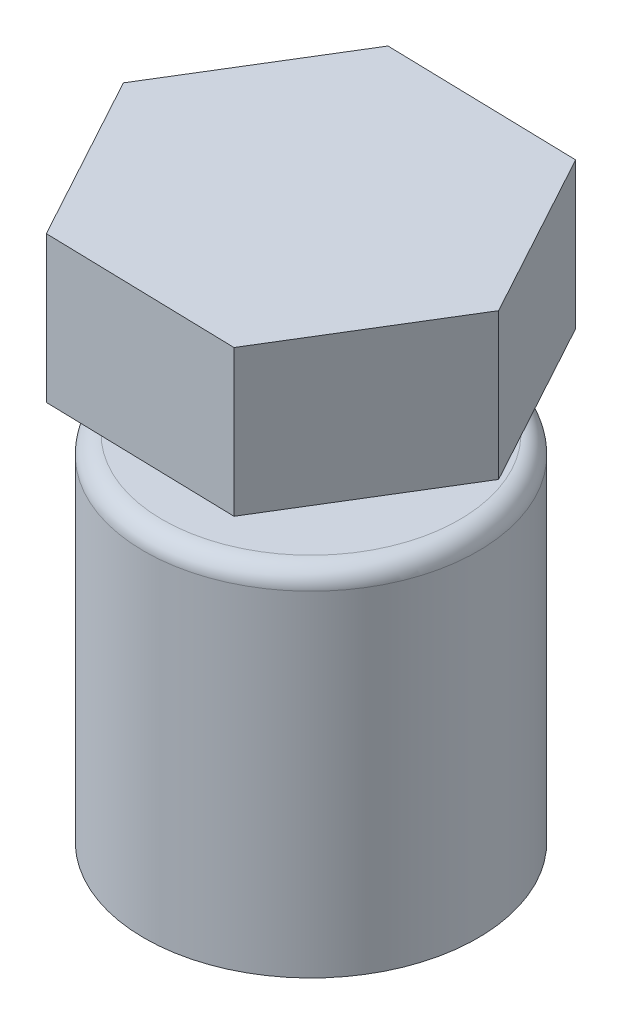
ISO-10303-21;
HEADER;
FILE_DESCRIPTION(('STEP AP214'),'2;1');
FILE_NAME('part.step','',(''),(''),'','','');
FILE_SCHEMA(('AUTOMOTIVE_DESIGN { 1 0 10303 214 1 1 1 1 }'));
ENDSEC;
DATA;
#1=APPLICATION_CONTEXT('core data for automotive mechanical design processes');
#2=APPLICATION_PROTOCOL_DEFINITION('international standard','automotive_design',2000,#1);
#3=PRODUCT_CONTEXT('',#1,'mechanical');
#4=PRODUCT('Part','Part','',(#3));
#5=PRODUCT_RELATED_PRODUCT_CATEGORY('part','',(#4));
#6=PRODUCT_DEFINITION_FORMATION('','',#4);
#7=PRODUCT_DEFINITION_CONTEXT('part definition',#1,'design');
#8=PRODUCT_DEFINITION('design','',#6,#7);
#9=PRODUCT_DEFINITION_SHAPE('','',#8);
#10=(LENGTH_UNIT() NAMED_UNIT(*) SI_UNIT(.MILLI.,.METRE.));
#11=(NAMED_UNIT(*) PLANE_ANGLE_UNIT() SI_UNIT($,.RADIAN.));
#12=(NAMED_UNIT(*) SI_UNIT($,.STERADIAN.) SOLID_ANGLE_UNIT());
#13=UNCERTAINTY_MEASURE_WITH_UNIT(LENGTH_MEASURE(1.E-05),#10,'distance_accuracy_value','');
#14=(GEOMETRIC_REPRESENTATION_CONTEXT(3) GLOBAL_UNCERTAINTY_ASSIGNED_CONTEXT((#13)) GLOBAL_UNIT_ASSIGNED_CONTEXT((#10,
#11,#12)) REPRESENTATION_CONTEXT('',''));
#15=CARTESIAN_POINT('',(0.,0.,0.));
#16=DIRECTION('',(0.,0.,1.));
#17=DIRECTION('',(1.,0.,0.));
#18=AXIS2_PLACEMENT_3D('',#15,#16,#17);
#19=CARTESIAN_POINT('',(25.1890899135529,67.5796969338963,46.2679708336783));
#20=DIRECTION('',(-0.853229121791607,0.,-0.521536255428827));
#21=DIRECTION('',(-0.521536255428827,0.,0.853229121791607));
#22=AXIS2_PLACEMENT_3D('',#19,#20,#21);
#23=PLANE('',#22);
#24=DIRECTION('',(0.521536255428827,0.,-0.853229121791607));
#25=VECTOR('',#24,1.);
#26=CARTESIAN_POINT('',(25.1890899135529,27.5796969338963,46.2679708336783));
#27=LINE('',#26,#25);
#28=CARTESIAN_POINT('',(25.1890899135529,27.5796969338963,46.2679708336783));
#29=VERTEX_POINT('',#28);
#30=CARTESIAN_POINT('',(52.6637830802993,27.5796969338963,1.31959365349194));
#31=VERTEX_POINT('',#30);
#32=EDGE_CURVE('E135',#29,#31,#27,.T.);
#33=ORIENTED_EDGE('',*,*,#32,.T.);
#34=DIRECTION('',(0.,-1.,0.));
#35=VECTOR('',#34,1.);
#36=CARTESIAN_POINT('',(52.6637830802993,67.5796969338963,1.31959365349194));
#37=LINE('',#36,#35);
#38=CARTESIAN_POINT('',(52.6637830802993,67.5796969338963,1.31959365349194));
#39=VERTEX_POINT('',#38);
#40=EDGE_CURVE('E12',#39,#31,#37,.T.);
#41=ORIENTED_EDGE('',*,*,#40,.F.);
#42=DIRECTION('',(0.521536255428827,0.,-0.853229121791607));
#43=VECTOR('',#42,1.);
#44=CARTESIAN_POINT('',(25.1890899135529,67.5796969338963,46.2679708336783));
#45=LINE('',#44,#43);
#46=CARTESIAN_POINT('',(25.1890899135529,67.5796969338963,46.2679708336783));
#47=VERTEX_POINT('',#46);
#48=EDGE_CURVE('E146',#47,#39,#45,.T.);
#49=ORIENTED_EDGE('',*,*,#48,.F.);
#50=DIRECTION('',(0.,-1.,0.));
#51=VECTOR('',#50,1.);
#52=CARTESIAN_POINT('',(25.1890899135529,67.5796969338963,46.2679708336783));
#53=LINE('',#52,#51);
#54=EDGE_CURVE('E131',#47,#29,#53,.T.);
#55=ORIENTED_EDGE('',*,*,#54,.T.);
#56=EDGE_LOOP('',(#33,#41,#49,#55));
#57=FACE_BOUND('',#56,.T.);
#58=ADVANCED_FACE('F51',(#57),#23,.F.);
#59=CARTESIAN_POINT('',(52.6637830802993,67.5796969338963,1.31959365349194));
#60=DIRECTION('',(-0.878278207091778,0.,0.478149967005805));
#61=DIRECTION('',(0.478149967005805,0.,0.878278207091778));
#62=AXIS2_PLACEMENT_3D('',#59,#60,#61);
#63=PLANE('',#62);
#64=DIRECTION('',(-0.478149967005805,0.,-0.878278207091778));
#65=VECTOR('',#64,1.);
#66=CARTESIAN_POINT('',(52.6637830802993,27.5796969338963,1.31959365349194));
#67=LINE('',#66,#65);
#68=CARTESIAN_POINT('',(27.4746931667464,27.5796969338963,-44.9483771801863));
#69=VERTEX_POINT('',#68);
#70=EDGE_CURVE('E138',#31,#69,#67,.T.);
#71=ORIENTED_EDGE('',*,*,#70,.T.);
#72=DIRECTION('',(0.,-1.,0.));
#73=VECTOR('',#72,1.);
#74=CARTESIAN_POINT('',(27.4746931667464,67.5796969338963,-44.9483771801863));
#75=LINE('',#74,#73);
#76=CARTESIAN_POINT('',(27.4746931667464,67.5796969338963,-44.9483771801863));
#77=VERTEX_POINT('',#76);
#78=EDGE_CURVE('E59',#77,#69,#75,.T.);
#79=ORIENTED_EDGE('',*,*,#78,.F.);
#80=DIRECTION('',(-0.478149967005805,0.,-0.878278207091778));
#81=VECTOR('',#80,1.);
#82=CARTESIAN_POINT('',(52.6637830802993,67.5796969338963,1.31959365349194));
#83=LINE('',#82,#81);
#84=EDGE_CURVE('E104',#39,#77,#83,.T.);
#85=ORIENTED_EDGE('',*,*,#84,.F.);
#86=ORIENTED_EDGE('',*,*,#40,.T.);
#87=EDGE_LOOP('',(#71,#79,#85,#86));
#88=FACE_BOUND('',#87,.T.);
#89=ADVANCED_FACE('F171',(#88),#63,.F.);
#90=CARTESIAN_POINT('',(27.4746931667464,67.5796969338963,-44.9483771801863));
#91=DIRECTION('',(-0.0250490853001705,0.,0.999686222434632));
#92=DIRECTION('',(0.999686222434632,0.,0.0250490853001705));
#93=AXIS2_PLACEMENT_3D('',#90,#91,#92);
#94=PLANE('',#93);
#95=DIRECTION('',(-0.999686222434632,0.,-0.0250490853001705));
#96=VECTOR('',#95,1.);
#97=CARTESIAN_POINT('',(27.4746931667464,27.5796969338963,-44.9483771801863));
#98=LINE('',#97,#96);
#99=CARTESIAN_POINT('',(-25.1890899135529,27.5796969338963,-46.2679708336783));
#100=VERTEX_POINT('',#99);
#101=EDGE_CURVE('E141',#69,#100,#98,.T.);
#102=ORIENTED_EDGE('',*,*,#101,.T.);
#103=DIRECTION('',(0.,-1.,0.));
#104=VECTOR('',#103,1.);
#105=CARTESIAN_POINT('',(-25.1890899135529,67.5796969338963,-46.2679708336783));
#106=LINE('',#105,#104);
#107=CARTESIAN_POINT('',(-25.1890899135529,67.5796969338963,-46.2679708336783));
#108=VERTEX_POINT('',#107);
#109=EDGE_CURVE('E126',#108,#100,#106,.T.);
#110=ORIENTED_EDGE('',*,*,#109,.F.);
#111=DIRECTION('',(-0.999686222434632,0.,-0.0250490853001705));
#112=VECTOR('',#111,1.);
#113=CARTESIAN_POINT('',(27.4746931667464,67.5796969338963,-44.9483771801863));
#114=LINE('',#113,#112);
#115=EDGE_CURVE('E117',#77,#108,#114,.T.);
#116=ORIENTED_EDGE('',*,*,#115,.F.);
#117=ORIENTED_EDGE('',*,*,#78,.T.);
#118=EDGE_LOOP('',(#102,#110,#116,#117));
#119=FACE_BOUND('',#118,.T.);
#120=ADVANCED_FACE('F152',(#119),#94,.F.);
#121=CARTESIAN_POINT('',(-25.1890899135529,67.5796969338963,-46.2679708336783));
#122=DIRECTION('',(0.853229121791607,0.,0.521536255428827));
#123=DIRECTION('',(0.521536255428827,0.,-0.853229121791607));
#124=AXIS2_PLACEMENT_3D('',#121,#122,#123);
#125=PLANE('',#124);
#126=DIRECTION('',(-0.521536255428827,0.,0.853229121791607));
#127=VECTOR('',#126,1.);
#128=CARTESIAN_POINT('',(-25.1890899135529,27.5796969338963,-46.2679708336783));
#129=LINE('',#128,#127);
#130=CARTESIAN_POINT('',(-52.6637830802993,27.5796969338963,-1.31959365349196));
#131=VERTEX_POINT('',#130);
#132=EDGE_CURVE('E125',#100,#131,#129,.T.);
#133=ORIENTED_EDGE('',*,*,#132,.T.);
#134=DIRECTION('',(0.,-1.,0.));
#135=VECTOR('',#134,1.);
#136=CARTESIAN_POINT('',(-52.6637830802993,67.5796969338963,-1.31959365349196));
#137=LINE('',#136,#135);
#138=CARTESIAN_POINT('',(-52.6637830802993,67.5796969338963,-1.31959365349196));
#139=VERTEX_POINT('',#138);
#140=EDGE_CURVE('E122',#139,#131,#137,.T.);
#141=ORIENTED_EDGE('',*,*,#140,.F.);
#142=DIRECTION('',(-0.521536255428827,0.,0.853229121791607));
#143=VECTOR('',#142,1.);
#144=CARTESIAN_POINT('',(-25.1890899135529,67.5796969338963,-46.2679708336783));
#145=LINE('',#144,#143);
#146=EDGE_CURVE('E111',#108,#139,#145,.T.);
#147=ORIENTED_EDGE('',*,*,#146,.F.);
#148=ORIENTED_EDGE('',*,*,#109,.T.);
#149=EDGE_LOOP('',(#133,#141,#147,#148));
#150=FACE_BOUND('',#149,.T.);
#151=ADVANCED_FACE('F123',(#150),#125,.F.);
#152=CARTESIAN_POINT('',(-52.6637830802993,67.5796969338963,-1.31959365349196));
#153=DIRECTION('',(0.878278207091778,0.,-0.478149967005805));
#154=DIRECTION('',(-0.478149967005805,0.,-0.878278207091778));
#155=AXIS2_PLACEMENT_3D('',#152,#153,#154);
#156=PLANE('',#155);
#157=DIRECTION('',(0.478149967005805,0.,0.878278207091778));
#158=VECTOR('',#157,1.);
#159=CARTESIAN_POINT('',(-52.6637830802993,27.5796969338963,-1.31959365349196));
#160=LINE('',#159,#158);
#161=CARTESIAN_POINT('',(-27.4746931667464,27.5796969338963,44.9483771801863));
#162=VERTEX_POINT('',#161);
#163=EDGE_CURVE('E90',#131,#162,#160,.T.);
#164=ORIENTED_EDGE('',*,*,#163,.T.);
#165=DIRECTION('',(0.,-1.,0.));
#166=VECTOR('',#165,1.);
#167=CARTESIAN_POINT('',(-27.4746931667464,67.5796969338963,44.9483771801863));
#168=LINE('',#167,#166);
#169=CARTESIAN_POINT('',(-27.4746931667464,67.5796969338963,44.9483771801863));
#170=VERTEX_POINT('',#169);
#171=EDGE_CURVE('E127',#170,#162,#168,.T.);
#172=ORIENTED_EDGE('',*,*,#171,.F.);
#173=DIRECTION('',(0.478149967005805,0.,0.878278207091778));
#174=VECTOR('',#173,1.);
#175=CARTESIAN_POINT('',(-52.6637830802993,67.5796969338963,-1.31959365349196));
#176=LINE('',#175,#174);
#177=EDGE_CURVE('E115',#139,#170,#176,.T.);
#178=ORIENTED_EDGE('',*,*,#177,.F.);
#179=ORIENTED_EDGE('',*,*,#140,.T.);
#180=EDGE_LOOP('',(#164,#172,#178,#179));
#181=FACE_BOUND('',#180,.T.);
#182=ADVANCED_FACE('F129',(#181),#156,.F.);
#183=CARTESIAN_POINT('',(-27.4746931667464,67.5796969338963,44.9483771801863));
#184=DIRECTION('',(0.0250490853001707,0.,-0.999686222434632));
#185=DIRECTION('',(-0.999686222434632,0.,-0.0250490853001707));
#186=AXIS2_PLACEMENT_3D('',#183,#184,#185);
#187=PLANE('',#186);
#188=DIRECTION('',(0.999686222434632,0.,0.0250490853001707));
#189=VECTOR('',#188,1.);
#190=CARTESIAN_POINT('',(-27.4746931667464,27.5796969338963,44.9483771801863));
#191=LINE('',#190,#189);
#192=EDGE_CURVE('E96',#162,#29,#191,.T.);
#193=ORIENTED_EDGE('',*,*,#192,.T.);
#194=ORIENTED_EDGE('',*,*,#54,.F.);
#195=DIRECTION('',(0.999686222434632,0.,0.0250490853001707));
#196=VECTOR('',#195,1.);
#197=CARTESIAN_POINT('',(-27.4746931667464,67.5796969338963,44.9483771801863));
#198=LINE('',#197,#196);
#199=EDGE_CURVE('E67',#170,#47,#198,.T.);
#200=ORIENTED_EDGE('',*,*,#199,.F.);
#201=ORIENTED_EDGE('',*,*,#171,.T.);
#202=EDGE_LOOP('',(#193,#194,#200,#201));
#203=FACE_BOUND('',#202,.T.);
#204=ADVANCED_FACE('F160',(#203),#187,.F.);
#205=CARTESIAN_POINT('',(0.,67.5796969338963,0.));
#206=DIRECTION('',(0.,1.,0.));
#207=DIRECTION('',(0.,0.,1.));
#208=AXIS2_PLACEMENT_3D('',#205,#206,#207);
#209=PLANE('',#208);
#210=ORIENTED_EDGE('',*,*,#48,.T.);
#211=ORIENTED_EDGE('',*,*,#84,.T.);
#212=ORIENTED_EDGE('',*,*,#115,.T.);
#213=ORIENTED_EDGE('',*,*,#146,.T.);
#214=ORIENTED_EDGE('',*,*,#177,.T.);
#215=ORIENTED_EDGE('',*,*,#199,.T.);
#216=EDGE_LOOP('',(#210,#211,#212,#213,#214,#215));
#217=FACE_BOUND('',#216,.T.);
#218=ADVANCED_FACE('F113',(#217),#209,.T.);
#219=CARTESIAN_POINT('',(0.,27.5796969338963,0.));
#220=DIRECTION('',(0.,1.,0.));
#221=DIRECTION('',(0.,0.,1.));
#222=AXIS2_PLACEMENT_3D('',#219,#220,#221);
#223=PLANE('',#222);
#224=ORIENTED_EDGE('',*,*,#32,.F.);
#225=ORIENTED_EDGE('',*,*,#192,.F.);
#226=ORIENTED_EDGE('',*,*,#163,.F.);
#227=ORIENTED_EDGE('',*,*,#132,.F.);
#228=ORIENTED_EDGE('',*,*,#101,.F.);
#229=ORIENTED_EDGE('',*,*,#70,.F.);
#230=EDGE_LOOP('',(#224,#225,#226,#227,#228,#229));
#231=FACE_BOUND('',#230,.T.);
#232=CARTESIAN_POINT('',(0.,27.5796969338963,0.));
#233=DIRECTION('',(0.,-1.,0.));
#234=DIRECTION('',(0.,0.,-1.));
#235=AXIS2_PLACEMENT_3D('',#232,#233,#234);
#236=CIRCLE('',#235,13.6609713784719);
#237=CARTESIAN_POINT('',(0.,27.5796969338963,-13.6609713784719));
#238=VERTEX_POINT('',#237);
#239=EDGE_CURVE('E294',#238,#238,#236,.T.);
#240=ORIENTED_EDGE('',*,*,#239,.F.);
#241=EDGE_LOOP('',(#240));
#242=FACE_BOUND('',#241,.T.);
#243=ADVANCED_FACE('F155',(#231,#242),#223,.F.);
#244=CARTESIAN_POINT('',(0.,53.6443526419248,0.));
#245=DIRECTION('',(0.,1.,0.));
#246=DIRECTION('',(0.,0.,1.));
#247=AXIS2_PLACEMENT_3D('',#244,#245,#246);
#248=PLANE('',#247);
#249=CARTESIAN_POINT('',(0.,53.6443526419248,0.));
#250=DIRECTION('',(0.,-1.,0.));
#251=DIRECTION('',(0.,0.,-1.));
#252=AXIS2_PLACEMENT_3D('',#249,#250,#251);
#253=CIRCLE('',#252,9.53690454723516);
#254=CARTESIAN_POINT('',(0.,53.6443526419248,-9.53690454723516));
#255=VERTEX_POINT('',#254);
#256=EDGE_CURVE('E139',#255,#255,#253,.T.);
#257=ORIENTED_EDGE('',*,*,#256,.T.);
#258=EDGE_LOOP('',(#257));
#259=FACE_BOUND('',#258,.T.);
#260=ADVANCED_FACE('F211',(#259),#248,.F.);
#261=CARTESIAN_POINT('',(0.,5.92834606990293,0.));
#262=DIRECTION('',(0.,-1.,0.));
#263=DIRECTION('',(0.,0.,-1.));
#264=AXIS2_PLACEMENT_3D('',#261,#262,#263);
#265=CYLINDRICAL_SURFACE('',#264,9.53690454723516);
#266=ORIENTED_EDGE('',*,*,#256,.F.);
#267=EDGE_LOOP('',(#266));
#268=FACE_BOUND('',#267,.T.);
#269=CARTESIAN_POINT('',(0.,41.4860456563702,0.));
#270=DIRECTION('',(0.,-1.,0.));
#271=DIRECTION('',(0.,0.,-1.));
#272=AXIS2_PLACEMENT_3D('',#269,#270,#271);
#273=CIRCLE('',#272,9.53690454723516);
#274=CARTESIAN_POINT('',(0.,41.4860456563702,-9.53690454723516));
#275=VERTEX_POINT('',#274);
#276=EDGE_CURVE('E296',#275,#275,#273,.T.);
#277=ORIENTED_EDGE('',*,*,#276,.T.);
#278=EDGE_LOOP('',(#277));
#279=FACE_BOUND('',#278,.T.);
#280=ADVANCED_FACE('F220',(#268,#279),#265,.F.);
#281=CARTESIAN_POINT('',(9.53690454723516,41.4860456563702,0.));
#282=DIRECTION('',(0.,1.,0.));
#283=DIRECTION('',(0.,0.,1.));
#284=AXIS2_PLACEMENT_3D('',#281,#282,#283);
#285=PLANE('',#284);
#286=ORIENTED_EDGE('',*,*,#276,.F.);
#287=EDGE_LOOP('',(#286));
#288=FACE_BOUND('',#287,.T.);
#289=CARTESIAN_POINT('',(0.,41.4860456563702,0.));
#290=DIRECTION('',(0.,-1.,0.));
#291=DIRECTION('',(0.,0.,-1.));
#292=AXIS2_PLACEMENT_3D('',#289,#290,#291);
#293=CIRCLE('',#292,13.6609713784719);
#294=CARTESIAN_POINT('',(0.,41.4860456563702,-13.6609713784719));
#295=VERTEX_POINT('',#294);
#296=EDGE_CURVE('E291',#295,#295,#293,.T.);
#297=ORIENTED_EDGE('',*,*,#296,.T.);
#298=EDGE_LOOP('',(#297));
#299=FACE_BOUND('',#298,.T.);
#300=ADVANCED_FACE('F231',(#288,#299),#285,.F.);
#301=CARTESIAN_POINT('',(0.,5.92834606990293,0.));
#302=DIRECTION('',(0.,-1.,0.));
#303=DIRECTION('',(0.,0.,-1.));
#304=AXIS2_PLACEMENT_3D('',#301,#302,#303);
#305=CYLINDRICAL_SURFACE('',#304,13.6609713784719);
#306=ORIENTED_EDGE('',*,*,#296,.F.);
#307=EDGE_LOOP('',(#306));
#308=FACE_BOUND('',#307,.T.);
#309=ORIENTED_EDGE('',*,*,#239,.T.);
#310=EDGE_LOOP('',(#309));
#311=FACE_BOUND('',#310,.T.);
#312=ADVANCED_FACE('F242',(#308,#311),#305,.F.);
#313=CLOSED_SHELL('',(#58,#89,#120,#151,#182,#204,#218,#243,#260,#280,#300,#312));
#314=MANIFOLD_SOLID_BREP('B2',#313);
#315=CARTESIAN_POINT('',(0.,53.6443526419248,0.));
#316=DIRECTION('',(0.,1.,0.));
#317=DIRECTION('',(0.,0.,1.));
#318=AXIS2_PLACEMENT_3D('',#315,#316,#317);
#319=PLANE('',#318);
#320=CARTESIAN_POINT('',(0.,53.6443526419248,0.));
#321=DIRECTION('',(0.,-1.,0.));
#322=DIRECTION('',(0.,0.,-1.));
#323=AXIS2_PLACEMENT_3D('',#320,#321,#322);
#324=CIRCLE('',#323,9.53690454723516);
#325=CARTESIAN_POINT('',(0.,53.6443526419248,-9.53690454723516));
#326=VERTEX_POINT('',#325);
#327=EDGE_CURVE('E324',#326,#326,#324,.T.);
#328=ORIENTED_EDGE('',*,*,#327,.F.);
#329=EDGE_LOOP('',(#328));
#330=FACE_BOUND('',#329,.T.);
#331=ADVANCED_FACE('F312',(#330),#319,.T.);
#332=CARTESIAN_POINT('',(0.,5.92834606990293,0.));
#333=DIRECTION('',(0.,-1.,0.));
#334=DIRECTION('',(0.,0.,-1.));
#335=AXIS2_PLACEMENT_3D('',#332,#333,#334);
#336=CYLINDRICAL_SURFACE('',#335,9.53690454723516);
#337=ORIENTED_EDGE('',*,*,#327,.T.);
#338=EDGE_LOOP('',(#337));
#339=FACE_BOUND('',#338,.T.);
#340=CARTESIAN_POINT('',(0.,41.4860456563702,0.));
#341=DIRECTION('',(0.,-1.,0.));
#342=DIRECTION('',(0.,0.,-1.));
#343=AXIS2_PLACEMENT_3D('',#340,#341,#342);
#344=CIRCLE('',#343,9.53690454723516);
#345=CARTESIAN_POINT('',(0.,41.4860456563702,-9.53690454723516));
#346=VERTEX_POINT('',#345);
#347=EDGE_CURVE('E328',#346,#346,#344,.T.);
#348=ORIENTED_EDGE('',*,*,#347,.F.);
#349=EDGE_LOOP('',(#348));
#350=FACE_BOUND('',#349,.T.);
#351=ADVANCED_FACE('F410',(#339,#350),#336,.T.);
#352=CARTESIAN_POINT('',(9.53690454723516,41.4860456563702,0.));
#353=DIRECTION('',(0.,1.,0.));
#354=DIRECTION('',(0.,0.,1.));
#355=AXIS2_PLACEMENT_3D('',#352,#353,#354);
#356=PLANE('',#355);
#357=ORIENTED_EDGE('',*,*,#347,.T.);
#358=EDGE_LOOP('',(#357));
#359=FACE_BOUND('',#358,.T.);
#360=CARTESIAN_POINT('',(0.,41.4860456563702,0.));
#361=DIRECTION('',(0.,-1.,0.));
#362=DIRECTION('',(0.,0.,-1.));
#363=AXIS2_PLACEMENT_3D('',#360,#361,#362);
#364=CIRCLE('',#363,13.6609713784719);
#365=CARTESIAN_POINT('',(0.,41.4860456563702,-13.6609713784719));
#366=VERTEX_POINT('',#365);
#367=EDGE_CURVE('E333',#366,#366,#364,.T.);
#368=ORIENTED_EDGE('',*,*,#367,.F.);
#369=EDGE_LOOP('',(#368));
#370=FACE_BOUND('',#369,.T.);
#371=ADVANCED_FACE('F406',(#359,#370),#356,.T.);
#372=CARTESIAN_POINT('',(0.,5.92834606990293,0.));
#373=DIRECTION('',(0.,-1.,0.));
#374=DIRECTION('',(0.,0.,-1.));
#375=AXIS2_PLACEMENT_3D('',#372,#373,#374);
#376=CYLINDRICAL_SURFACE('',#375,13.6609713784719);
#377=ORIENTED_EDGE('',*,*,#367,.T.);
#378=EDGE_LOOP('',(#377));
#379=FACE_BOUND('',#378,.T.);
#380=CARTESIAN_POINT('',(0.,27.5796969338963,0.));
#381=DIRECTION('',(0.,-1.,0.));
#382=DIRECTION('',(0.,0.,-1.));
#383=AXIS2_PLACEMENT_3D('',#380,#381,#382);
#384=CIRCLE('',#383,13.6609713784719);
#385=CARTESIAN_POINT('',(0.,27.5796969338963,-13.6609713784719));
#386=VERTEX_POINT('',#385);
#387=EDGE_CURVE('E336',#386,#386,#384,.T.);
#388=ORIENTED_EDGE('',*,*,#387,.F.);
#389=EDGE_LOOP('',(#388));
#390=FACE_BOUND('',#389,.T.);
#391=ADVANCED_FACE('F402',(#379,#390),#376,.T.);
#392=CARTESIAN_POINT('',(13.6609713784719,27.5796969338963,0.));
#393=DIRECTION('',(0.,1.,0.));
#394=DIRECTION('',(0.,0.,1.));
#395=AXIS2_PLACEMENT_3D('',#392,#393,#394);
#396=PLANE('',#395);
#397=ORIENTED_EDGE('',*,*,#387,.T.);
#398=EDGE_LOOP('',(#397));
#399=FACE_BOUND('',#398,.T.);
#400=CARTESIAN_POINT('',(0.,27.5796969338963,0.));
#401=DIRECTION('',(0.,-1.,0.));
#402=DIRECTION('',(0.,0.,-1.));
#403=AXIS2_PLACEMENT_3D('',#400,#401,#402);
#404=CIRCLE('',#403,15.4446758921267);
#405=CARTESIAN_POINT('',(0.,27.5796969338963,-15.4446758921267));
#406=VERTEX_POINT('',#405);
#407=EDGE_CURVE('E339',#406,#406,#404,.T.);
#408=ORIENTED_EDGE('',*,*,#407,.F.);
#409=EDGE_LOOP('',(#408));
#410=FACE_BOUND('',#409,.T.);
#411=ADVANCED_FACE('F398',(#399,#410),#396,.T.);
#412=CARTESIAN_POINT('',(0.,5.92834606990293,0.));
#413=DIRECTION('',(0.,-1.,0.));
#414=DIRECTION('',(0.,0.,-1.));
#415=AXIS2_PLACEMENT_3D('',#412,#413,#414);
#416=CYLINDRICAL_SURFACE('',#415,15.4446758921267);
#417=ORIENTED_EDGE('',*,*,#407,.T.);
#418=EDGE_LOOP('',(#417));
#419=FACE_BOUND('',#418,.T.);
#420=CARTESIAN_POINT('',(0.,23.7133842796117,0.));
#421=DIRECTION('',(0.,-1.,0.));
#422=DIRECTION('',(0.,0.,-1.));
#423=AXIS2_PLACEMENT_3D('',#420,#421,#422);
#424=CIRCLE('',#423,15.4446758921267);
#425=CARTESIAN_POINT('',(0.,23.7133842796117,-15.4446758921267));
#426=VERTEX_POINT('',#425);
#427=EDGE_CURVE('E342',#426,#426,#424,.T.);
#428=ORIENTED_EDGE('',*,*,#427,.F.);
#429=EDGE_LOOP('',(#428));
#430=FACE_BOUND('',#429,.T.);
#431=ADVANCED_FACE('F394',(#419,#430),#416,.T.);
#432=CARTESIAN_POINT('',(15.4446758921267,23.7133842796117,0.));
#433=DIRECTION('',(0.,-1.,0.));
#434=DIRECTION('',(0.,0.,-1.));
#435=AXIS2_PLACEMENT_3D('',#432,#433,#434);
#436=PLANE('',#435);
#437=ORIENTED_EDGE('',*,*,#427,.T.);
#438=EDGE_LOOP('',(#437));
#439=FACE_BOUND('',#438,.T.);
#440=CARTESIAN_POINT('',(0.,23.7133842796117,0.));
#441=DIRECTION('',(0.,-1.,0.));
#442=DIRECTION('',(0.,0.,-1.));
#443=AXIS2_PLACEMENT_3D('',#440,#441,#442);
#444=CIRCLE('',#443,13.6609713784719);
#445=CARTESIAN_POINT('',(0.,23.7133842796117,-13.6609713784719));
#446=VERTEX_POINT('',#445);
#447=EDGE_CURVE('E345',#446,#446,#444,.T.);
#448=ORIENTED_EDGE('',*,*,#447,.F.);
#449=EDGE_LOOP('',(#448));
#450=FACE_BOUND('',#449,.T.);
#451=ADVANCED_FACE('F390',(#439,#450),#436,.T.);
#452=CARTESIAN_POINT('',(0.,5.92834606990293,0.));
#453=DIRECTION('',(0.,-1.,0.));
#454=DIRECTION('',(0.,0.,-1.));
#455=AXIS2_PLACEMENT_3D('',#452,#453,#454);
#456=CYLINDRICAL_SURFACE('',#455,13.6609713784719);
#457=ORIENTED_EDGE('',*,*,#447,.T.);
#458=EDGE_LOOP('',(#457));
#459=FACE_BOUND('',#458,.T.);
#460=CARTESIAN_POINT('',(0.,11.3411837859013,0.));
#461=DIRECTION('',(0.,-1.,0.));
#462=DIRECTION('',(0.,0.,-1.));
#463=AXIS2_PLACEMENT_3D('',#460,#461,#462);
#464=CIRCLE('',#463,13.6609713784719);
#465=CARTESIAN_POINT('',(0.,11.3411837859013,-13.6609713784719));
#466=VERTEX_POINT('',#465);
#467=EDGE_CURVE('E348',#466,#466,#464,.T.);
#468=ORIENTED_EDGE('',*,*,#467,.F.);
#469=EDGE_LOOP('',(#468));
#470=FACE_BOUND('',#469,.T.);
#471=ADVANCED_FACE('F387',(#459,#470),#456,.T.);
#472=CARTESIAN_POINT('',(13.6609713784719,11.3411837859013,0.));
#473=DIRECTION('',(0.,1.,0.));
#474=DIRECTION('',(0.,0.,1.));
#475=AXIS2_PLACEMENT_3D('',#472,#473,#474);
#476=PLANE('',#475);
#477=CARTESIAN_POINT('',(0.,11.3411837859013,0.));
#478=DIRECTION('',(0.,1.,0.));
#479=DIRECTION('',(0.,0.,1.));
#480=AXIS2_PLACEMENT_3D('',#477,#478,#479);
#481=CIRCLE('',#480,40.6224893205573);
#482=CARTESIAN_POINT('',(0.,11.3411837859013,40.6224893205573));
#483=VERTEX_POINT('',#482);
#484=EDGE_CURVE('E50',#483,#483,#481,.T.);
#485=ORIENTED_EDGE('',*,*,#484,.T.);
#486=EDGE_LOOP('',(#485));
#487=FACE_BOUND('',#486,.T.);
#488=ORIENTED_EDGE('',*,*,#467,.T.);
#489=EDGE_LOOP('',(#488));
#490=FACE_BOUND('',#489,.T.);
#491=ADVANCED_FACE('F384',(#487,#490),#476,.T.);
#492=CARTESIAN_POINT('',(0.,5.92834606990293,0.));
#493=DIRECTION('',(0.,-1.,0.));
#494=DIRECTION('',(0.,0.,-1.));
#495=AXIS2_PLACEMENT_3D('',#492,#493,#494);
#496=CYLINDRICAL_SURFACE('',#495,45.6224893205573);
#497=CARTESIAN_POINT('',(0.,6.34118378590126,0.));
#498=DIRECTION('',(0.,1.,0.));
#499=DIRECTION('',(0.,0.,1.));
#500=AXIS2_PLACEMENT_3D('',#497,#498,#499);
#501=CIRCLE('',#500,45.6224893205573);
#502=CARTESIAN_POINT('',(0.,6.34118378590126,45.6224893205573));
#503=VERTEX_POINT('',#502);
#504=EDGE_CURVE('E320',#503,#503,#501,.F.);
#505=ORIENTED_EDGE('',*,*,#504,.T.);
#506=EDGE_LOOP('',(#505));
#507=FACE_BOUND('',#506,.T.);
#508=CARTESIAN_POINT('',(0.,-85.3166325712118,0.));
#509=DIRECTION('',(0.,-1.,0.));
#510=DIRECTION('',(0.,0.,-1.));
#511=AXIS2_PLACEMENT_3D('',#508,#509,#510);
#512=CIRCLE('',#511,45.6224893205573);
#513=CARTESIAN_POINT('',(0.,-85.3166325712118,-45.6224893205573));
#514=VERTEX_POINT('',#513);
#515=EDGE_CURVE('E351',#514,#514,#512,.T.);
#516=ORIENTED_EDGE('',*,*,#515,.F.);
#517=EDGE_LOOP('',(#516));
#518=FACE_BOUND('',#517,.T.);
#519=ADVANCED_FACE('F380',(#507,#518),#496,.T.);
#520=CARTESIAN_POINT('',(45.6224893205573,-85.3166325712118,0.));
#521=DIRECTION('',(0.,-1.,0.));
#522=DIRECTION('',(0.,0.,-1.));
#523=AXIS2_PLACEMENT_3D('',#520,#521,#522);
#524=PLANE('',#523);
#525=ORIENTED_EDGE('',*,*,#515,.T.);
#526=EDGE_LOOP('',(#525));
#527=FACE_BOUND('',#526,.T.);
#528=ADVANCED_FACE('F377',(#527),#524,.T.);
#529=CARTESIAN_POINT('',(0.,6.34118378590126,0.));
#530=DIRECTION('',(0.,1.,0.));
#531=DIRECTION('',(0.,0.,1.));
#532=AXIS2_PLACEMENT_3D('',#529,#530,#531);
#533=TOROIDAL_SURFACE('',#532,40.6224893205573,5.);
#534=ORIENTED_EDGE('',*,*,#484,.F.);
#535=EDGE_LOOP('',(#534));
#536=FACE_BOUND('',#535,.T.);
#537=ORIENTED_EDGE('',*,*,#504,.F.);
#538=EDGE_LOOP('',(#537));
#539=FACE_BOUND('',#538,.T.);
#540=ADVANCED_FACE('F314',(#536,#539),#533,.T.);
#541=CLOSED_SHELL('',(#331,#351,#371,#391,#411,#431,#451,#471,#491,#519,#528,#540));
#542=CARTESIAN_POINT('',(0.,-75.7797280239767,0.));
#543=DIRECTION('',(0.,1.,0.));
#544=DIRECTION('',(0.,0.,1.));
#545=AXIS2_PLACEMENT_3D('',#542,#543,#544);
#546=PLANE('',#545);
#547=CARTESIAN_POINT('',(0.,-75.7797280239767,0.));
#548=DIRECTION('',(0.,-1.,0.));
#549=DIRECTION('',(0.,0.,-1.));
#550=AXIS2_PLACEMENT_3D('',#547,#548,#549);
#551=CIRCLE('',#550,40.9829141354159);
#552=CARTESIAN_POINT('',(0.,-75.7797280239767,-40.9829141354159));
#553=VERTEX_POINT('',#552);
#554=EDGE_CURVE('E354',#553,#553,#551,.T.);
#555=ORIENTED_EDGE('',*,*,#554,.F.);
#556=EDGE_LOOP('',(#555));
#557=FACE_BOUND('',#556,.T.);
#558=ADVANCED_FACE('F365',(#557),#546,.T.);
#559=CARTESIAN_POINT('',(0.,5.92834606990293,0.));
#560=DIRECTION('',(0.,-1.,0.));
#561=DIRECTION('',(0.,0.,-1.));
#562=AXIS2_PLACEMENT_3D('',#559,#560,#561);
#563=CYLINDRICAL_SURFACE('',#562,40.9829141354159);
#564=ORIENTED_EDGE('',*,*,#554,.T.);
#565=EDGE_LOOP('',(#564));
#566=FACE_BOUND('',#565,.T.);
#567=CARTESIAN_POINT('',(0.,5.92834606990293,0.));
#568=DIRECTION('',(0.,-1.,0.));
#569=DIRECTION('',(0.,0.,-1.));
#570=AXIS2_PLACEMENT_3D('',#567,#568,#569);
#571=CIRCLE('',#570,40.9829141354159);
#572=CARTESIAN_POINT('',(0.,5.92834606990293,-40.9829141354159));
#573=VERTEX_POINT('',#572);
#574=EDGE_CURVE('E357',#573,#573,#571,.T.);
#575=ORIENTED_EDGE('',*,*,#574,.F.);
#576=EDGE_LOOP('',(#575));
#577=FACE_BOUND('',#576,.T.);
#578=ADVANCED_FACE('F363',(#566,#577),#563,.F.);
#579=CARTESIAN_POINT('',(40.9829141354159,5.92834606990293,0.));
#580=DIRECTION('',(0.,-1.,0.));
#581=DIRECTION('',(0.,0.,-1.));
#582=AXIS2_PLACEMENT_3D('',#579,#580,#581);
#583=PLANE('',#582);
#584=ORIENTED_EDGE('',*,*,#574,.T.);
#585=EDGE_LOOP('',(#584));
#586=FACE_BOUND('',#585,.T.);
#587=ADVANCED_FACE('F361',(#586),#583,.T.);
#588=CLOSED_SHELL('',(#558,#578,#587));
#589=ORIENTED_CLOSED_SHELL('',*,#588,.T.);
#590=BREP_WITH_VOIDS('B6',#541,(#589));
#591=ADVANCED_BREP_SHAPE_REPRESENTATION('',(#18,#314,#590),#14);
#592=SHAPE_DEFINITION_REPRESENTATION(#9,#591);
ENDSEC;
END-ISO-10303-21;
